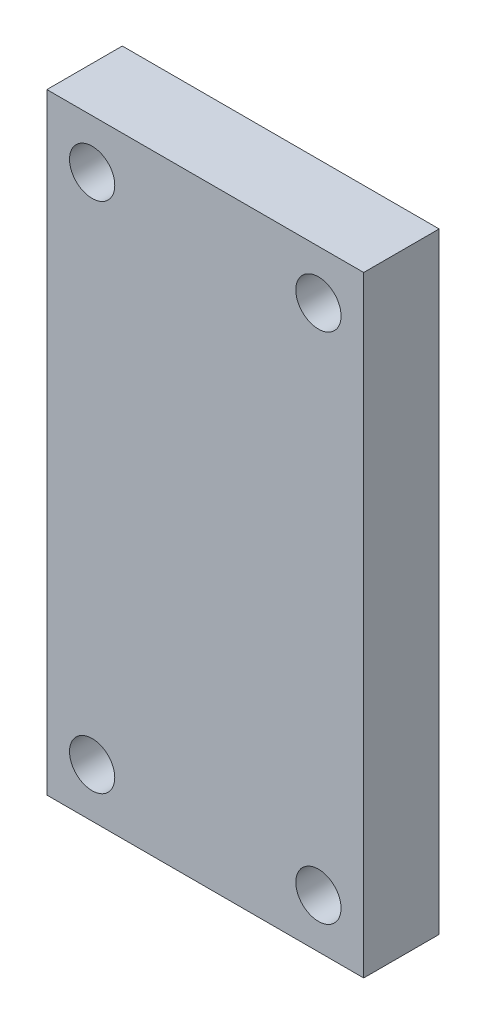
ISO-10303-21;
HEADER;
FILE_DESCRIPTION(('STEP AP214'),'2;1');
FILE_NAME('part.step','',(''),(''),'','','');
FILE_SCHEMA(('AUTOMOTIVE_DESIGN { 1 0 10303 214 1 1 1 1 }'));
ENDSEC;
DATA;
#1=APPLICATION_CONTEXT('core data for automotive mechanical design processes');
#2=APPLICATION_PROTOCOL_DEFINITION('international standard','automotive_design',2000,#1);
#3=PRODUCT_CONTEXT('',#1,'mechanical');
#4=PRODUCT('Part','Part','',(#3));
#5=PRODUCT_RELATED_PRODUCT_CATEGORY('part','',(#4));
#6=PRODUCT_DEFINITION_FORMATION('','',#4);
#7=PRODUCT_DEFINITION_CONTEXT('part definition',#1,'design');
#8=PRODUCT_DEFINITION('design','',#6,#7);
#9=PRODUCT_DEFINITION_SHAPE('','',#8);
#10=(LENGTH_UNIT() NAMED_UNIT(*) SI_UNIT(.MILLI.,.METRE.));
#11=(NAMED_UNIT(*) PLANE_ANGLE_UNIT() SI_UNIT($,.RADIAN.));
#12=(NAMED_UNIT(*) SI_UNIT($,.STERADIAN.) SOLID_ANGLE_UNIT());
#13=UNCERTAINTY_MEASURE_WITH_UNIT(LENGTH_MEASURE(1.E-05),#10,'distance_accuracy_value','');
#14=(GEOMETRIC_REPRESENTATION_CONTEXT(3) GLOBAL_UNCERTAINTY_ASSIGNED_CONTEXT((#13)) GLOBAL_UNIT_ASSIGNED_CONTEXT((#10,
#11,#12)) REPRESENTATION_CONTEXT('',''));
#15=CARTESIAN_POINT('',(0.,0.,0.));
#16=DIRECTION('',(0.,0.,1.));
#17=DIRECTION('',(1.,0.,0.));
#18=AXIS2_PLACEMENT_3D('',#15,#16,#17);
#19=CARTESIAN_POINT('',(10.5,20.25,5.));
#20=DIRECTION('',(-1.,0.,0.));
#21=DIRECTION('',(0.,-1.,0.));
#22=AXIS2_PLACEMENT_3D('',#19,#20,#21);
#23=PLANE('',#22);
#24=DIRECTION('',(0.,1.,0.));
#25=VECTOR('',#24,1.);
#26=CARTESIAN_POINT('',(10.5,20.25,0.));
#27=LINE('',#26,#25);
#28=CARTESIAN_POINT('',(10.5,-20.25,0.));
#29=VERTEX_POINT('',#28);
#30=CARTESIAN_POINT('',(10.5,20.25,0.));
#31=VERTEX_POINT('',#30);
#32=EDGE_CURVE('E98',#29,#31,#27,.T.);
#33=ORIENTED_EDGE('',*,*,#32,.T.);
#34=DIRECTION('',(0.,0.,-1.));
#35=VECTOR('',#34,1.);
#36=CARTESIAN_POINT('',(10.5,20.25,5.));
#37=LINE('',#36,#35);
#38=CARTESIAN_POINT('',(10.5,20.25,5.));
#39=VERTEX_POINT('',#38);
#40=EDGE_CURVE('E11',#39,#31,#37,.T.);
#41=ORIENTED_EDGE('',*,*,#40,.F.);
#42=DIRECTION('',(0.,1.,0.));
#43=VECTOR('',#42,1.);
#44=CARTESIAN_POINT('',(10.5,20.25,5.));
#45=LINE('',#44,#43);
#46=CARTESIAN_POINT('',(10.5,-20.25,5.));
#47=VERTEX_POINT('',#46);
#48=EDGE_CURVE('E86',#47,#39,#45,.T.);
#49=ORIENTED_EDGE('',*,*,#48,.F.);
#50=DIRECTION('',(0.,0.,-1.));
#51=VECTOR('',#50,1.);
#52=CARTESIAN_POINT('',(10.5,-20.25,5.));
#53=LINE('',#52,#51);
#54=EDGE_CURVE('E94',#47,#29,#53,.T.);
#55=ORIENTED_EDGE('',*,*,#54,.T.);
#56=EDGE_LOOP('',(#33,#41,#49,#55));
#57=FACE_BOUND('',#56,.T.);
#58=ADVANCED_FACE('F35',(#57),#23,.F.);
#59=CARTESIAN_POINT('',(-10.5,20.25,5.));
#60=DIRECTION('',(0.,-1.,0.));
#61=DIRECTION('',(0.,0.,-1.));
#62=AXIS2_PLACEMENT_3D('',#59,#60,#61);
#63=PLANE('',#62);
#64=DIRECTION('',(-1.,0.,0.));
#65=VECTOR('',#64,1.);
#66=CARTESIAN_POINT('',(-10.5,20.25,0.));
#67=LINE('',#66,#65);
#68=CARTESIAN_POINT('',(-10.5,20.25,0.));
#69=VERTEX_POINT('',#68);
#70=EDGE_CURVE('E90',#31,#69,#67,.T.);
#71=ORIENTED_EDGE('',*,*,#70,.T.);
#72=DIRECTION('',(0.,0.,-1.));
#73=VECTOR('',#72,1.);
#74=CARTESIAN_POINT('',(-10.5,20.25,5.));
#75=LINE('',#74,#73);
#76=CARTESIAN_POINT('',(-10.5,20.25,5.));
#77=VERTEX_POINT('',#76);
#78=EDGE_CURVE('E43',#77,#69,#75,.T.);
#79=ORIENTED_EDGE('',*,*,#78,.F.);
#80=DIRECTION('',(-1.,0.,0.));
#81=VECTOR('',#80,1.);
#82=CARTESIAN_POINT('',(-10.5,20.25,5.));
#83=LINE('',#82,#81);
#84=EDGE_CURVE('E81',#39,#77,#83,.T.);
#85=ORIENTED_EDGE('',*,*,#84,.F.);
#86=ORIENTED_EDGE('',*,*,#40,.T.);
#87=EDGE_LOOP('',(#71,#79,#85,#86));
#88=FACE_BOUND('',#87,.T.);
#89=ADVANCED_FACE('F89',(#88),#63,.F.);
#90=CARTESIAN_POINT('',(-10.5,20.25,5.));
#91=DIRECTION('',(1.,0.,0.));
#92=DIRECTION('',(0.,1.,0.));
#93=AXIS2_PLACEMENT_3D('',#90,#91,#92);
#94=PLANE('',#93);
#95=DIRECTION('',(0.,-1.,0.));
#96=VECTOR('',#95,1.);
#97=CARTESIAN_POINT('',(-10.5,20.25,0.));
#98=LINE('',#97,#96);
#99=CARTESIAN_POINT('',(-10.5,-20.25,0.));
#100=VERTEX_POINT('',#99);
#101=EDGE_CURVE('E68',#69,#100,#98,.T.);
#102=ORIENTED_EDGE('',*,*,#101,.T.);
#103=DIRECTION('',(0.,0.,-1.));
#104=VECTOR('',#103,1.);
#105=CARTESIAN_POINT('',(-10.5,-20.25,5.));
#106=LINE('',#105,#104);
#107=CARTESIAN_POINT('',(-10.5,-20.25,5.));
#108=VERTEX_POINT('',#107);
#109=EDGE_CURVE('E91',#108,#100,#106,.T.);
#110=ORIENTED_EDGE('',*,*,#109,.F.);
#111=DIRECTION('',(0.,-1.,0.));
#112=VECTOR('',#111,1.);
#113=CARTESIAN_POINT('',(-10.5,20.25,5.));
#114=LINE('',#113,#112);
#115=EDGE_CURVE('E84',#77,#108,#114,.T.);
#116=ORIENTED_EDGE('',*,*,#115,.F.);
#117=ORIENTED_EDGE('',*,*,#78,.T.);
#118=EDGE_LOOP('',(#102,#110,#116,#117));
#119=FACE_BOUND('',#118,.T.);
#120=ADVANCED_FACE('F92',(#119),#94,.F.);
#121=CARTESIAN_POINT('',(-10.5,-20.25,5.));
#122=DIRECTION('',(0.,1.,0.));
#123=DIRECTION('',(0.,0.,1.));
#124=AXIS2_PLACEMENT_3D('',#121,#122,#123);
#125=PLANE('',#124);
#126=DIRECTION('',(1.,0.,0.));
#127=VECTOR('',#126,1.);
#128=CARTESIAN_POINT('',(-10.5,-20.25,0.));
#129=LINE('',#128,#127);
#130=EDGE_CURVE('E74',#100,#29,#129,.T.);
#131=ORIENTED_EDGE('',*,*,#130,.T.);
#132=ORIENTED_EDGE('',*,*,#54,.F.);
#133=DIRECTION('',(1.,0.,0.));
#134=VECTOR('',#133,1.);
#135=CARTESIAN_POINT('',(-10.5,-20.25,5.));
#136=LINE('',#135,#134);
#137=EDGE_CURVE('E51',#108,#47,#136,.T.);
#138=ORIENTED_EDGE('',*,*,#137,.F.);
#139=ORIENTED_EDGE('',*,*,#109,.T.);
#140=EDGE_LOOP('',(#131,#132,#138,#139));
#141=FACE_BOUND('',#140,.T.);
#142=ADVANCED_FACE('F106',(#141),#125,.F.);
#143=CARTESIAN_POINT('',(0.,0.,5.));
#144=DIRECTION('',(0.,0.,1.));
#145=DIRECTION('',(1.,0.,0.));
#146=AXIS2_PLACEMENT_3D('',#143,#144,#145);
#147=PLANE('',#146);
#148=CARTESIAN_POINT('',(7.5,17.,5.));
#149=DIRECTION('',(0.,0.,1.));
#150=DIRECTION('',(1.,0.,0.));
#151=AXIS2_PLACEMENT_3D('',#148,#149,#150);
#152=CIRCLE('',#151,1.5);
#153=CARTESIAN_POINT('',(9.,17.,5.));
#154=VERTEX_POINT('',#153);
#155=EDGE_CURVE('E130',#154,#154,#152,.T.);
#156=ORIENTED_EDGE('',*,*,#155,.F.);
#157=EDGE_LOOP('',(#156));
#158=FACE_BOUND('',#157,.T.);
#159=CARTESIAN_POINT('',(-7.5,-17.,5.));
#160=DIRECTION('',(0.,0.,1.));
#161=DIRECTION('',(1.,0.,0.));
#162=AXIS2_PLACEMENT_3D('',#159,#160,#161);
#163=CIRCLE('',#162,1.5);
#164=CARTESIAN_POINT('',(-6.,-17.,5.));
#165=VERTEX_POINT('',#164);
#166=EDGE_CURVE('E124',#165,#165,#163,.T.);
#167=ORIENTED_EDGE('',*,*,#166,.F.);
#168=EDGE_LOOP('',(#167));
#169=FACE_BOUND('',#168,.T.);
#170=CARTESIAN_POINT('',(7.5,-17.,5.));
#171=DIRECTION('',(0.,0.,1.));
#172=DIRECTION('',(1.,0.,0.));
#173=AXIS2_PLACEMENT_3D('',#170,#171,#172);
#174=CIRCLE('',#173,1.5);
#175=CARTESIAN_POINT('',(9.,-17.,5.));
#176=VERTEX_POINT('',#175);
#177=EDGE_CURVE('E118',#176,#176,#174,.T.);
#178=ORIENTED_EDGE('',*,*,#177,.F.);
#179=EDGE_LOOP('',(#178));
#180=FACE_BOUND('',#179,.T.);
#181=CARTESIAN_POINT('',(-7.5,17.,5.));
#182=DIRECTION('',(0.,0.,1.));
#183=DIRECTION('',(1.,0.,0.));
#184=AXIS2_PLACEMENT_3D('',#181,#182,#183);
#185=CIRCLE('',#184,1.5);
#186=CARTESIAN_POINT('',(-6.,17.,5.));
#187=VERTEX_POINT('',#186);
#188=EDGE_CURVE('E112',#187,#187,#185,.T.);
#189=ORIENTED_EDGE('',*,*,#188,.F.);
#190=EDGE_LOOP('',(#189));
#191=FACE_BOUND('',#190,.T.);
#192=ORIENTED_EDGE('',*,*,#48,.T.);
#193=ORIENTED_EDGE('',*,*,#84,.T.);
#194=ORIENTED_EDGE('',*,*,#115,.T.);
#195=ORIENTED_EDGE('',*,*,#137,.T.);
#196=EDGE_LOOP('',(#192,#193,#194,#195));
#197=FACE_BOUND('',#196,.T.);
#198=ADVANCED_FACE('F82',(#158,#169,#180,#191,#197),#147,.T.);
#199=CARTESIAN_POINT('',(0.,0.,0.));
#200=DIRECTION('',(0.,0.,1.));
#201=DIRECTION('',(1.,0.,0.));
#202=AXIS2_PLACEMENT_3D('',#199,#200,#201);
#203=PLANE('',#202);
#204=CARTESIAN_POINT('',(7.5,17.,0.));
#205=DIRECTION('',(0.,0.,1.));
#206=DIRECTION('',(1.,0.,0.));
#207=AXIS2_PLACEMENT_3D('',#204,#205,#206);
#208=CIRCLE('',#207,1.5);
#209=CARTESIAN_POINT('',(9.,17.,0.));
#210=VERTEX_POINT('',#209);
#211=EDGE_CURVE('E115',#210,#210,#208,.T.);
#212=ORIENTED_EDGE('',*,*,#211,.T.);
#213=EDGE_LOOP('',(#212));
#214=FACE_BOUND('',#213,.T.);
#215=CARTESIAN_POINT('',(-7.5,-17.,0.));
#216=DIRECTION('',(0.,0.,1.));
#217=DIRECTION('',(1.,0.,0.));
#218=AXIS2_PLACEMENT_3D('',#215,#216,#217);
#219=CIRCLE('',#218,1.5);
#220=CARTESIAN_POINT('',(-6.,-17.,0.));
#221=VERTEX_POINT('',#220);
#222=EDGE_CURVE('E127',#221,#221,#219,.T.);
#223=ORIENTED_EDGE('',*,*,#222,.T.);
#224=EDGE_LOOP('',(#223));
#225=FACE_BOUND('',#224,.T.);
#226=CARTESIAN_POINT('',(7.5,-17.,0.));
#227=DIRECTION('',(0.,0.,1.));
#228=DIRECTION('',(1.,0.,0.));
#229=AXIS2_PLACEMENT_3D('',#226,#227,#228);
#230=CIRCLE('',#229,1.5);
#231=CARTESIAN_POINT('',(9.,-17.,0.));
#232=VERTEX_POINT('',#231);
#233=EDGE_CURVE('E121',#232,#232,#230,.T.);
#234=ORIENTED_EDGE('',*,*,#233,.T.);
#235=EDGE_LOOP('',(#234));
#236=FACE_BOUND('',#235,.T.);
#237=CARTESIAN_POINT('',(-7.5,17.,0.));
#238=DIRECTION('',(0.,0.,1.));
#239=DIRECTION('',(1.,0.,0.));
#240=AXIS2_PLACEMENT_3D('',#237,#238,#239);
#241=CIRCLE('',#240,1.5);
#242=CARTESIAN_POINT('',(-6.,17.,0.));
#243=VERTEX_POINT('',#242);
#244=EDGE_CURVE('E101',#243,#243,#241,.T.);
#245=ORIENTED_EDGE('',*,*,#244,.T.);
#246=EDGE_LOOP('',(#245));
#247=FACE_BOUND('',#246,.T.);
#248=ORIENTED_EDGE('',*,*,#32,.F.);
#249=ORIENTED_EDGE('',*,*,#130,.F.);
#250=ORIENTED_EDGE('',*,*,#101,.F.);
#251=ORIENTED_EDGE('',*,*,#70,.F.);
#252=EDGE_LOOP('',(#248,#249,#250,#251));
#253=FACE_BOUND('',#252,.T.);
#254=ADVANCED_FACE('F109',(#214,#225,#236,#247,#253),#203,.F.);
#255=CARTESIAN_POINT('',(-7.5,17.,0.));
#256=DIRECTION('',(0.,0.,1.));
#257=DIRECTION('',(1.,0.,0.));
#258=AXIS2_PLACEMENT_3D('',#255,#256,#257);
#259=CYLINDRICAL_SURFACE('',#258,1.5);
#260=ORIENTED_EDGE('',*,*,#244,.F.);
#261=EDGE_LOOP('',(#260));
#262=FACE_BOUND('',#261,.T.);
#263=ORIENTED_EDGE('',*,*,#188,.T.);
#264=EDGE_LOOP('',(#263));
#265=FACE_BOUND('',#264,.T.);
#266=ADVANCED_FACE('F154',(#262,#265),#259,.F.);
#267=CARTESIAN_POINT('',(7.5,-17.,0.));
#268=DIRECTION('',(0.,0.,1.));
#269=DIRECTION('',(1.,0.,0.));
#270=AXIS2_PLACEMENT_3D('',#267,#268,#269);
#271=CYLINDRICAL_SURFACE('',#270,1.5);
#272=ORIENTED_EDGE('',*,*,#233,.F.);
#273=EDGE_LOOP('',(#272));
#274=FACE_BOUND('',#273,.T.);
#275=ORIENTED_EDGE('',*,*,#177,.T.);
#276=EDGE_LOOP('',(#275));
#277=FACE_BOUND('',#276,.T.);
#278=ADVANCED_FACE('F156',(#274,#277),#271,.F.);
#279=CARTESIAN_POINT('',(-7.5,-17.,0.));
#280=DIRECTION('',(0.,0.,1.));
#281=DIRECTION('',(1.,0.,0.));
#282=AXIS2_PLACEMENT_3D('',#279,#280,#281);
#283=CYLINDRICAL_SURFACE('',#282,1.5);
#284=ORIENTED_EDGE('',*,*,#222,.F.);
#285=EDGE_LOOP('',(#284));
#286=FACE_BOUND('',#285,.T.);
#287=ORIENTED_EDGE('',*,*,#166,.T.);
#288=EDGE_LOOP('',(#287));
#289=FACE_BOUND('',#288,.T.);
#290=ADVANCED_FACE('F141',(#286,#289),#283,.F.);
#291=CARTESIAN_POINT('',(7.5,17.,0.));
#292=DIRECTION('',(0.,0.,1.));
#293=DIRECTION('',(1.,0.,0.));
#294=AXIS2_PLACEMENT_3D('',#291,#292,#293);
#295=CYLINDRICAL_SURFACE('',#294,1.5);
#296=ORIENTED_EDGE('',*,*,#211,.F.);
#297=EDGE_LOOP('',(#296));
#298=FACE_BOUND('',#297,.T.);
#299=ORIENTED_EDGE('',*,*,#155,.T.);
#300=EDGE_LOOP('',(#299));
#301=FACE_BOUND('',#300,.T.);
#302=ADVANCED_FACE('F138',(#298,#301),#295,.F.);
#303=CLOSED_SHELL('',(#58,#89,#120,#142,#198,#254,#266,#278,#290,#302));
#304=MANIFOLD_SOLID_BREP('B2',#303);
#305=ADVANCED_BREP_SHAPE_REPRESENTATION('',(#18,#304),#14);
#306=SHAPE_DEFINITION_REPRESENTATION(#9,#305);
ENDSEC;
END-ISO-10303-21;
